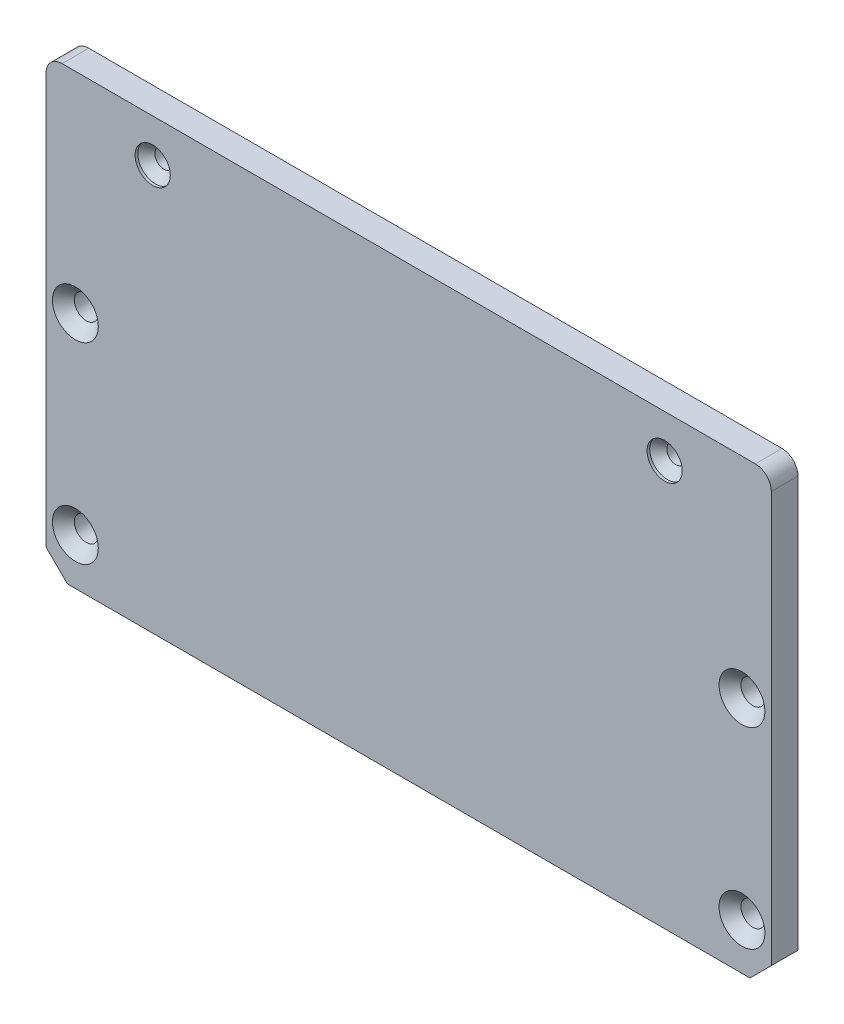
ISO-10303-21;
HEADER;
FILE_DESCRIPTION(('STEP AP214'),'2;1');
FILE_NAME('part.step','',(''),(''),'','','');
FILE_SCHEMA(('AUTOMOTIVE_DESIGN { 1 0 10303 214 1 1 1 1 }'));
ENDSEC;
DATA;
#1=APPLICATION_CONTEXT('core data for automotive mechanical design processes');
#2=APPLICATION_PROTOCOL_DEFINITION('international standard','automotive_design',2000,#1);
#3=PRODUCT_CONTEXT('',#1,'mechanical');
#4=PRODUCT('Part','Part','',(#3));
#5=PRODUCT_RELATED_PRODUCT_CATEGORY('part','',(#4));
#6=PRODUCT_DEFINITION_FORMATION('','',#4);
#7=PRODUCT_DEFINITION_CONTEXT('part definition',#1,'design');
#8=PRODUCT_DEFINITION('design','',#6,#7);
#9=PRODUCT_DEFINITION_SHAPE('','',#8);
#10=(LENGTH_UNIT() NAMED_UNIT(*) SI_UNIT(.MILLI.,.METRE.));
#11=(NAMED_UNIT(*) PLANE_ANGLE_UNIT() SI_UNIT($,.RADIAN.));
#12=(NAMED_UNIT(*) SI_UNIT($,.STERADIAN.) SOLID_ANGLE_UNIT());
#13=UNCERTAINTY_MEASURE_WITH_UNIT(LENGTH_MEASURE(1.E-05),#10,'distance_accuracy_value','');
#14=(GEOMETRIC_REPRESENTATION_CONTEXT(3) GLOBAL_UNCERTAINTY_ASSIGNED_CONTEXT((#13)) GLOBAL_UNIT_ASSIGNED_CONTEXT((#10,
#11,#12)) REPRESENTATION_CONTEXT('',''));
#15=CARTESIAN_POINT('',(0.,0.,0.));
#16=DIRECTION('',(0.,0.,1.));
#17=DIRECTION('',(1.,0.,0.));
#18=AXIS2_PLACEMENT_3D('',#15,#16,#17);
#19=CARTESIAN_POINT('',(-68.,0.,5.));
#20=DIRECTION('',(1.,0.,0.));
#21=DIRECTION('',(0.,0.,-1.));
#22=AXIS2_PLACEMENT_3D('',#19,#20,#21);
#23=PLANE('',#22);
#24=DIRECTION('',(0.,-1.,0.));
#25=VECTOR('',#24,1.);
#26=CARTESIAN_POINT('',(-68.,0.,5.));
#27=LINE('',#26,#25);
#28=CARTESIAN_POINT('',(-68.,81.,5.));
#29=VERTEX_POINT('',#28);
#30=CARTESIAN_POINT('',(-68.,4.00000000000005,5.));
#31=VERTEX_POINT('',#30);
#32=EDGE_CURVE('E110',#29,#31,#27,.T.);
#33=ORIENTED_EDGE('',*,*,#32,.F.);
#34=DIRECTION('',(0.,0.,-1.));
#35=VECTOR('',#34,1.);
#36=CARTESIAN_POINT('',(-68.,81.,5.));
#37=LINE('',#36,#35);
#38=CARTESIAN_POINT('',(-68.,81.,0.));
#39=VERTEX_POINT('',#38);
#40=EDGE_CURVE('E11',#29,#39,#37,.T.);
#41=ORIENTED_EDGE('',*,*,#40,.T.);
#42=DIRECTION('',(0.,-1.,0.));
#43=VECTOR('',#42,1.);
#44=CARTESIAN_POINT('',(-68.,0.,0.));
#45=LINE('',#44,#43);
#46=CARTESIAN_POINT('',(-68.,4.00000000000005,0.));
#47=VERTEX_POINT('',#46);
#48=EDGE_CURVE('E112',#39,#47,#45,.T.);
#49=ORIENTED_EDGE('',*,*,#48,.T.);
#50=DIRECTION('',(0.,0.,1.));
#51=VECTOR('',#50,1.);
#52=CARTESIAN_POINT('',(-68.,4.00000000000005,5.));
#53=LINE('',#52,#51);
#54=EDGE_CURVE('E125',#47,#31,#53,.T.);
#55=ORIENTED_EDGE('',*,*,#54,.T.);
#56=EDGE_LOOP('',(#33,#41,#49,#55));
#57=FACE_BOUND('',#56,.T.);
#58=ADVANCED_FACE('F17',(#57),#23,.F.);
#59=CARTESIAN_POINT('',(-68.,0.,5.));
#60=DIRECTION('',(0.,1.,0.));
#61=DIRECTION('',(0.,0.,1.));
#62=AXIS2_PLACEMENT_3D('',#59,#60,#61);
#63=PLANE('',#62);
#64=DIRECTION('',(1.,0.,0.));
#65=VECTOR('',#64,1.);
#66=CARTESIAN_POINT('',(-68.,0.,0.));
#67=LINE('',#66,#65);
#68=CARTESIAN_POINT('',(-64.,0.,0.));
#69=VERTEX_POINT('',#68);
#70=CARTESIAN_POINT('',(64.,0.,0.));
#71=VERTEX_POINT('',#70);
#72=EDGE_CURVE('E107',#69,#71,#67,.T.);
#73=ORIENTED_EDGE('',*,*,#72,.T.);
#74=DIRECTION('',(0.,0.,1.));
#75=VECTOR('',#74,1.);
#76=CARTESIAN_POINT('',(64.,0.,5.));
#77=LINE('',#76,#75);
#78=CARTESIAN_POINT('',(64.,0.,5.));
#79=VERTEX_POINT('',#78);
#80=EDGE_CURVE('E90',#71,#79,#77,.T.);
#81=ORIENTED_EDGE('',*,*,#80,.T.);
#82=DIRECTION('',(1.,0.,0.));
#83=VECTOR('',#82,1.);
#84=CARTESIAN_POINT('',(-68.,0.,5.));
#85=LINE('',#84,#83);
#86=CARTESIAN_POINT('',(-64.,0.,5.));
#87=VERTEX_POINT('',#86);
#88=EDGE_CURVE('E187',#87,#79,#85,.T.);
#89=ORIENTED_EDGE('',*,*,#88,.F.);
#90=DIRECTION('',(0.,0.,-1.));
#91=VECTOR('',#90,1.);
#92=CARTESIAN_POINT('',(-64.,0.,5.));
#93=LINE('',#92,#91);
#94=EDGE_CURVE('E95',#87,#69,#93,.T.);
#95=ORIENTED_EDGE('',*,*,#94,.T.);
#96=EDGE_LOOP('',(#73,#81,#89,#95));
#97=FACE_BOUND('',#96,.T.);
#98=ADVANCED_FACE('F160',(#97),#63,.F.);
#99=CARTESIAN_POINT('',(68.,0.,5.));
#100=DIRECTION('',(-1.,0.,0.));
#101=DIRECTION('',(0.,0.,1.));
#102=AXIS2_PLACEMENT_3D('',#99,#100,#101);
#103=PLANE('',#102);
#104=DIRECTION('',(0.,1.,0.));
#105=VECTOR('',#104,1.);
#106=CARTESIAN_POINT('',(68.,0.,0.));
#107=LINE('',#106,#105);
#108=CARTESIAN_POINT('',(68.,4.,0.));
#109=VERTEX_POINT('',#108);
#110=CARTESIAN_POINT('',(68.,81.,0.));
#111=VERTEX_POINT('',#110);
#112=EDGE_CURVE('E99',#109,#111,#107,.T.);
#113=ORIENTED_EDGE('',*,*,#112,.T.);
#114=DIRECTION('',(0.,0.,-1.));
#115=VECTOR('',#114,1.);
#116=CARTESIAN_POINT('',(68.,81.,5.));
#117=LINE('',#116,#115);
#118=CARTESIAN_POINT('',(68.,81.,5.));
#119=VERTEX_POINT('',#118);
#120=EDGE_CURVE('E40',#111,#119,#117,.F.);
#121=ORIENTED_EDGE('',*,*,#120,.T.);
#122=DIRECTION('',(0.,1.,0.));
#123=VECTOR('',#122,1.);
#124=CARTESIAN_POINT('',(68.,0.,5.));
#125=LINE('',#124,#123);
#126=CARTESIAN_POINT('',(68.,4.,5.));
#127=VERTEX_POINT('',#126);
#128=EDGE_CURVE('E100',#127,#119,#125,.T.);
#129=ORIENTED_EDGE('',*,*,#128,.F.);
#130=DIRECTION('',(0.,0.,-1.));
#131=VECTOR('',#130,1.);
#132=CARTESIAN_POINT('',(68.,4.,5.));
#133=LINE('',#132,#131);
#134=EDGE_CURVE('E89',#127,#109,#133,.T.);
#135=ORIENTED_EDGE('',*,*,#134,.T.);
#136=EDGE_LOOP('',(#113,#121,#129,#135));
#137=FACE_BOUND('',#136,.T.);
#138=ADVANCED_FACE('F98',(#137),#103,.F.);
#139=CARTESIAN_POINT('',(-68.,84.,5.));
#140=DIRECTION('',(0.,-1.,0.));
#141=DIRECTION('',(0.,0.,-1.));
#142=AXIS2_PLACEMENT_3D('',#139,#140,#141);
#143=PLANE('',#142);
#144=DIRECTION('',(-1.,0.,0.));
#145=VECTOR('',#144,1.);
#146=CARTESIAN_POINT('',(-68.,84.,5.));
#147=LINE('',#146,#145);
#148=CARTESIAN_POINT('',(65.,84.,5.));
#149=VERTEX_POINT('',#148);
#150=CARTESIAN_POINT('',(-65.,84.,5.));
#151=VERTEX_POINT('',#150);
#152=EDGE_CURVE('E101',#149,#151,#147,.T.);
#153=ORIENTED_EDGE('',*,*,#152,.F.);
#154=DIRECTION('',(0.,0.,-1.));
#155=VECTOR('',#154,1.);
#156=CARTESIAN_POINT('',(65.,84.,5.));
#157=LINE('',#156,#155);
#158=CARTESIAN_POINT('',(65.,84.,0.));
#159=VERTEX_POINT('',#158);
#160=EDGE_CURVE('E130',#149,#159,#157,.T.);
#161=ORIENTED_EDGE('',*,*,#160,.T.);
#162=DIRECTION('',(-1.,0.,0.));
#163=VECTOR('',#162,1.);
#164=CARTESIAN_POINT('',(-68.,84.,0.));
#165=LINE('',#164,#163);
#166=CARTESIAN_POINT('',(-65.,84.,0.));
#167=VERTEX_POINT('',#166);
#168=EDGE_CURVE('E106',#159,#167,#165,.T.);
#169=ORIENTED_EDGE('',*,*,#168,.T.);
#170=DIRECTION('',(0.,0.,-1.));
#171=VECTOR('',#170,1.);
#172=CARTESIAN_POINT('',(-65.,84.,5.));
#173=LINE('',#172,#171);
#174=EDGE_CURVE('E128',#167,#151,#173,.F.);
#175=ORIENTED_EDGE('',*,*,#174,.T.);
#176=EDGE_LOOP('',(#153,#161,#169,#175));
#177=FACE_BOUND('',#176,.T.);
#178=ADVANCED_FACE('F143',(#177),#143,.F.);
#179=CARTESIAN_POINT('',(0.,0.,5.));
#180=DIRECTION('',(0.,0.,-1.));
#181=DIRECTION('',(-1.,0.,0.));
#182=AXIS2_PLACEMENT_3D('',#179,#180,#181);
#183=PLANE('',#182);
#184=CARTESIAN_POINT('',(-48.,76.,5.));
#185=DIRECTION('',(0.,0.,1.));
#186=DIRECTION('',(1.,0.,0.));
#187=AXIS2_PLACEMENT_3D('',#184,#185,#186);
#188=CIRCLE('',#187,3.3);
#189=CARTESIAN_POINT('',(-44.7,76.,5.));
#190=VERTEX_POINT('',#189);
#191=EDGE_CURVE('E252',#190,#190,#188,.T.);
#192=ORIENTED_EDGE('',*,*,#191,.F.);
#193=EDGE_LOOP('',(#192));
#194=FACE_BOUND('',#193,.T.);
#195=CARTESIAN_POINT('',(48.,76.,5.));
#196=DIRECTION('',(0.,0.,1.));
#197=DIRECTION('',(1.,0.,0.));
#198=AXIS2_PLACEMENT_3D('',#195,#196,#197);
#199=CIRCLE('',#198,3.3);
#200=CARTESIAN_POINT('',(51.3,76.,5.));
#201=VERTEX_POINT('',#200);
#202=EDGE_CURVE('E240',#201,#201,#199,.T.);
#203=ORIENTED_EDGE('',*,*,#202,.F.);
#204=EDGE_LOOP('',(#203));
#205=FACE_BOUND('',#204,.T.);
#206=CARTESIAN_POINT('',(-62.5,44.7,5.));
#207=DIRECTION('',(0.,0.,1.));
#208=DIRECTION('',(1.,0.,0.));
#209=AXIS2_PLACEMENT_3D('',#206,#207,#208);
#210=CIRCLE('',#209,4.3);
#211=CARTESIAN_POINT('',(-58.2,44.7,5.));
#212=VERTEX_POINT('',#211);
#213=EDGE_CURVE('E228',#212,#212,#210,.T.);
#214=ORIENTED_EDGE('',*,*,#213,.F.);
#215=EDGE_LOOP('',(#214));
#216=FACE_BOUND('',#215,.T.);
#217=CARTESIAN_POINT('',(62.5,44.7,5.));
#218=DIRECTION('',(0.,0.,1.));
#219=DIRECTION('',(1.,0.,0.));
#220=AXIS2_PLACEMENT_3D('',#217,#218,#219);
#221=CIRCLE('',#220,4.3);
#222=CARTESIAN_POINT('',(66.8,44.7,5.));
#223=VERTEX_POINT('',#222);
#224=EDGE_CURVE('E219',#223,#223,#221,.T.);
#225=ORIENTED_EDGE('',*,*,#224,.F.);
#226=EDGE_LOOP('',(#225));
#227=FACE_BOUND('',#226,.T.);
#228=CARTESIAN_POINT('',(62.5,8.7,5.));
#229=DIRECTION('',(0.,0.,1.));
#230=DIRECTION('',(1.,0.,0.));
#231=AXIS2_PLACEMENT_3D('',#228,#229,#230);
#232=CIRCLE('',#231,4.3);
#233=CARTESIAN_POINT('',(66.8,8.7,5.));
#234=VERTEX_POINT('',#233);
#235=EDGE_CURVE('E210',#234,#234,#232,.T.);
#236=ORIENTED_EDGE('',*,*,#235,.F.);
#237=EDGE_LOOP('',(#236));
#238=FACE_BOUND('',#237,.T.);
#239=CARTESIAN_POINT('',(-62.5,8.7,5.));
#240=DIRECTION('',(0.,0.,1.));
#241=DIRECTION('',(1.,0.,0.));
#242=AXIS2_PLACEMENT_3D('',#239,#240,#241);
#243=CIRCLE('',#242,4.3);
#244=CARTESIAN_POINT('',(-58.2,8.7,5.));
#245=VERTEX_POINT('',#244);
#246=EDGE_CURVE('E199',#245,#245,#243,.T.);
#247=ORIENTED_EDGE('',*,*,#246,.F.);
#248=EDGE_LOOP('',(#247));
#249=FACE_BOUND('',#248,.T.);
#250=ORIENTED_EDGE('',*,*,#128,.T.);
#251=CARTESIAN_POINT('',(65.,81.,5.));
#252=DIRECTION('',(0.,0.,-1.));
#253=DIRECTION('',(-1.,0.,0.));
#254=AXIS2_PLACEMENT_3D('',#251,#252,#253);
#255=CIRCLE('',#254,3.);
#256=EDGE_CURVE('E25',#119,#149,#255,.F.);
#257=ORIENTED_EDGE('',*,*,#256,.T.);
#258=ORIENTED_EDGE('',*,*,#152,.T.);
#259=CARTESIAN_POINT('',(-65.,81.,5.));
#260=DIRECTION('',(0.,0.,-1.));
#261=DIRECTION('',(-1.,0.,0.));
#262=AXIS2_PLACEMENT_3D('',#259,#260,#261);
#263=CIRCLE('',#262,3.);
#264=EDGE_CURVE('E32',#151,#29,#263,.F.);
#265=ORIENTED_EDGE('',*,*,#264,.T.);
#266=ORIENTED_EDGE('',*,*,#32,.T.);
#267=DIRECTION('',(-0.707106781186545,0.70710678118655,0.));
#268=VECTOR('',#267,1.);
#269=CARTESIAN_POINT('',(-64.,0.,5.));
#270=LINE('',#269,#268);
#271=EDGE_CURVE('E121',#31,#87,#270,.F.);
#272=ORIENTED_EDGE('',*,*,#271,.T.);
#273=ORIENTED_EDGE('',*,*,#88,.T.);
#274=DIRECTION('',(-0.707106781186551,-0.707106781186544,0.));
#275=VECTOR('',#274,1.);
#276=CARTESIAN_POINT('',(68.,4.,5.));
#277=LINE('',#276,#275);
#278=EDGE_CURVE('E123',#79,#127,#277,.F.);
#279=ORIENTED_EDGE('',*,*,#278,.T.);
#280=EDGE_LOOP('',(#250,#257,#258,#265,#266,#272,#273,#279));
#281=FACE_BOUND('',#280,.T.);
#282=ADVANCED_FACE('F139',(#194,#205,#216,#227,#238,#249,#281),#183,.F.);
#283=CARTESIAN_POINT('',(0.,0.,0.));
#284=DIRECTION('',(0.,0.,-1.));
#285=DIRECTION('',(-1.,0.,0.));
#286=AXIS2_PLACEMENT_3D('',#283,#284,#285);
#287=PLANE('',#286);
#288=CARTESIAN_POINT('',(-48.,76.,0.));
#289=DIRECTION('',(0.,0.,1.));
#290=DIRECTION('',(1.,0.,0.));
#291=AXIS2_PLACEMENT_3D('',#288,#289,#290);
#292=CIRCLE('',#291,1.7);
#293=CARTESIAN_POINT('',(-46.3,76.,0.));
#294=VERTEX_POINT('',#293);
#295=EDGE_CURVE('E243',#294,#294,#292,.T.);
#296=ORIENTED_EDGE('',*,*,#295,.T.);
#297=EDGE_LOOP('',(#296));
#298=FACE_BOUND('',#297,.T.);
#299=CARTESIAN_POINT('',(48.,76.,0.));
#300=DIRECTION('',(0.,0.,1.));
#301=DIRECTION('',(1.,0.,0.));
#302=AXIS2_PLACEMENT_3D('',#299,#300,#301);
#303=CIRCLE('',#302,1.7);
#304=CARTESIAN_POINT('',(49.7,76.,0.));
#305=VERTEX_POINT('',#304);
#306=EDGE_CURVE('E231',#305,#305,#303,.T.);
#307=ORIENTED_EDGE('',*,*,#306,.T.);
#308=EDGE_LOOP('',(#307));
#309=FACE_BOUND('',#308,.T.);
#310=CARTESIAN_POINT('',(-62.5,44.7,0.));
#311=DIRECTION('',(0.,0.,1.));
#312=DIRECTION('',(1.,0.,0.));
#313=AXIS2_PLACEMENT_3D('',#310,#311,#312);
#314=CIRCLE('',#313,2.25);
#315=CARTESIAN_POINT('',(-60.25,44.7,0.));
#316=VERTEX_POINT('',#315);
#317=EDGE_CURVE('E222',#316,#316,#314,.T.);
#318=ORIENTED_EDGE('',*,*,#317,.T.);
#319=EDGE_LOOP('',(#318));
#320=FACE_BOUND('',#319,.T.);
#321=CARTESIAN_POINT('',(62.5,44.7,0.));
#322=DIRECTION('',(0.,0.,1.));
#323=DIRECTION('',(1.,0.,0.));
#324=AXIS2_PLACEMENT_3D('',#321,#322,#323);
#325=CIRCLE('',#324,2.25);
#326=CARTESIAN_POINT('',(64.75,44.7,0.));
#327=VERTEX_POINT('',#326);
#328=EDGE_CURVE('E213',#327,#327,#325,.T.);
#329=ORIENTED_EDGE('',*,*,#328,.T.);
#330=EDGE_LOOP('',(#329));
#331=FACE_BOUND('',#330,.T.);
#332=CARTESIAN_POINT('',(62.5,8.7,0.));
#333=DIRECTION('',(0.,0.,1.));
#334=DIRECTION('',(1.,0.,0.));
#335=AXIS2_PLACEMENT_3D('',#332,#333,#334);
#336=CIRCLE('',#335,2.25);
#337=CARTESIAN_POINT('',(64.75,8.7,0.));
#338=VERTEX_POINT('',#337);
#339=EDGE_CURVE('E204',#338,#338,#336,.T.);
#340=ORIENTED_EDGE('',*,*,#339,.T.);
#341=EDGE_LOOP('',(#340));
#342=FACE_BOUND('',#341,.T.);
#343=CARTESIAN_POINT('',(-62.5,8.7,0.));
#344=DIRECTION('',(0.,0.,1.));
#345=DIRECTION('',(1.,0.,0.));
#346=AXIS2_PLACEMENT_3D('',#343,#344,#345);
#347=CIRCLE('',#346,2.25);
#348=CARTESIAN_POINT('',(-60.25,8.7,0.));
#349=VERTEX_POINT('',#348);
#350=EDGE_CURVE('E192',#349,#349,#347,.T.);
#351=ORIENTED_EDGE('',*,*,#350,.T.);
#352=EDGE_LOOP('',(#351));
#353=FACE_BOUND('',#352,.T.);
#354=ORIENTED_EDGE('',*,*,#168,.F.);
#355=CARTESIAN_POINT('',(65.,81.,0.));
#356=DIRECTION('',(0.,0.,-1.));
#357=DIRECTION('',(-1.,0.,0.));
#358=AXIS2_PLACEMENT_3D('',#355,#356,#357);
#359=CIRCLE('',#358,3.);
#360=EDGE_CURVE('E105',#159,#111,#359,.T.);
#361=ORIENTED_EDGE('',*,*,#360,.T.);
#362=ORIENTED_EDGE('',*,*,#112,.F.);
#363=DIRECTION('',(0.707106781186551,0.707106781186544,0.));
#364=VECTOR('',#363,1.);
#365=CARTESIAN_POINT('',(31.9999999999996,-32.,0.));
#366=LINE('',#365,#364);
#367=EDGE_CURVE('E85',#109,#71,#366,.F.);
#368=ORIENTED_EDGE('',*,*,#367,.T.);
#369=ORIENTED_EDGE('',*,*,#72,.F.);
#370=DIRECTION('',(0.707106781186545,-0.70710678118655,0.));
#371=VECTOR('',#370,1.);
#372=CARTESIAN_POINT('',(-32.,-32.,0.));
#373=LINE('',#372,#371);
#374=EDGE_CURVE('E96',#69,#47,#373,.F.);
#375=ORIENTED_EDGE('',*,*,#374,.T.);
#376=ORIENTED_EDGE('',*,*,#48,.F.);
#377=CARTESIAN_POINT('',(-65.,81.,0.));
#378=DIRECTION('',(0.,0.,-1.));
#379=DIRECTION('',(-1.,0.,0.));
#380=AXIS2_PLACEMENT_3D('',#377,#378,#379);
#381=CIRCLE('',#380,3.);
#382=EDGE_CURVE('E133',#39,#167,#381,.T.);
#383=ORIENTED_EDGE('',*,*,#382,.T.);
#384=EDGE_LOOP('',(#354,#361,#362,#368,#369,#375,#376,#383));
#385=FACE_BOUND('',#384,.T.);
#386=ADVANCED_FACE('F104',(#298,#309,#320,#331,#342,#353,#385),#287,.T.);
#387=CARTESIAN_POINT('',(-62.5,8.7,5.));
#388=DIRECTION('',(0.,0.,1.));
#389=DIRECTION('',(1.,0.,0.));
#390=AXIS2_PLACEMENT_3D('',#387,#388,#389);
#391=CYLINDRICAL_SURFACE('',#390,2.25);
#392=ORIENTED_EDGE('',*,*,#350,.F.);
#393=EDGE_LOOP('',(#392));
#394=FACE_BOUND('',#393,.T.);
#395=CARTESIAN_POINT('',(-62.5,8.7,2.95));
#396=DIRECTION('',(0.,0.,1.));
#397=DIRECTION('',(1.,0.,0.));
#398=AXIS2_PLACEMENT_3D('',#395,#396,#397);
#399=CIRCLE('',#398,2.25);
#400=CARTESIAN_POINT('',(-60.25,8.7,2.95));
#401=VERTEX_POINT('',#400);
#402=EDGE_CURVE('E195',#401,#401,#399,.T.);
#403=ORIENTED_EDGE('',*,*,#402,.T.);
#404=EDGE_LOOP('',(#403));
#405=FACE_BOUND('',#404,.T.);
#406=ADVANCED_FACE('F273',(#394,#405),#391,.F.);
#407=CARTESIAN_POINT('',(-62.5,8.7,5.));
#408=DIRECTION('',(0.,0.,1.));
#409=DIRECTION('',(1.,0.,0.));
#410=AXIS2_PLACEMENT_3D('',#407,#408,#409);
#411=CONICAL_SURFACE('',#410,4.3,0.785398163397448);
#412=ORIENTED_EDGE('',*,*,#402,.F.);
#413=EDGE_LOOP('',(#412));
#414=FACE_BOUND('',#413,.T.);
#415=ORIENTED_EDGE('',*,*,#246,.T.);
#416=EDGE_LOOP('',(#415));
#417=FACE_BOUND('',#416,.T.);
#418=ADVANCED_FACE('F270',(#414,#417),#411,.F.);
#419=CARTESIAN_POINT('',(62.5,8.7,5.));
#420=DIRECTION('',(0.,0.,1.));
#421=DIRECTION('',(1.,0.,0.));
#422=AXIS2_PLACEMENT_3D('',#419,#420,#421);
#423=CYLINDRICAL_SURFACE('',#422,2.25);
#424=ORIENTED_EDGE('',*,*,#339,.F.);
#425=EDGE_LOOP('',(#424));
#426=FACE_BOUND('',#425,.T.);
#427=CARTESIAN_POINT('',(62.5,8.7,2.95));
#428=DIRECTION('',(0.,0.,1.));
#429=DIRECTION('',(1.,0.,0.));
#430=AXIS2_PLACEMENT_3D('',#427,#428,#429);
#431=CIRCLE('',#430,2.25);
#432=CARTESIAN_POINT('',(64.75,8.7,2.95));
#433=VERTEX_POINT('',#432);
#434=EDGE_CURVE('E207',#433,#433,#431,.T.);
#435=ORIENTED_EDGE('',*,*,#434,.T.);
#436=EDGE_LOOP('',(#435));
#437=FACE_BOUND('',#436,.T.);
#438=ADVANCED_FACE('F272',(#426,#437),#423,.F.);
#439=CARTESIAN_POINT('',(62.5,8.7,5.));
#440=DIRECTION('',(0.,0.,1.));
#441=DIRECTION('',(1.,0.,0.));
#442=AXIS2_PLACEMENT_3D('',#439,#440,#441);
#443=CONICAL_SURFACE('',#442,4.3,0.785398163397448);
#444=ORIENTED_EDGE('',*,*,#434,.F.);
#445=EDGE_LOOP('',(#444));
#446=FACE_BOUND('',#445,.T.);
#447=ORIENTED_EDGE('',*,*,#235,.T.);
#448=EDGE_LOOP('',(#447));
#449=FACE_BOUND('',#448,.T.);
#450=ADVANCED_FACE('F280',(#446,#449),#443,.F.);
#451=CARTESIAN_POINT('',(62.5,44.7,5.));
#452=DIRECTION('',(0.,0.,1.));
#453=DIRECTION('',(1.,0.,0.));
#454=AXIS2_PLACEMENT_3D('',#451,#452,#453);
#455=CYLINDRICAL_SURFACE('',#454,2.25);
#456=ORIENTED_EDGE('',*,*,#328,.F.);
#457=EDGE_LOOP('',(#456));
#458=FACE_BOUND('',#457,.T.);
#459=CARTESIAN_POINT('',(62.5,44.7,2.95));
#460=DIRECTION('',(0.,0.,1.));
#461=DIRECTION('',(1.,0.,0.));
#462=AXIS2_PLACEMENT_3D('',#459,#460,#461);
#463=CIRCLE('',#462,2.25);
#464=CARTESIAN_POINT('',(64.75,44.7,2.95));
#465=VERTEX_POINT('',#464);
#466=EDGE_CURVE('E216',#465,#465,#463,.T.);
#467=ORIENTED_EDGE('',*,*,#466,.T.);
#468=EDGE_LOOP('',(#467));
#469=FACE_BOUND('',#468,.T.);
#470=ADVANCED_FACE('F342',(#458,#469),#455,.F.);
#471=CARTESIAN_POINT('',(62.5,44.7,5.));
#472=DIRECTION('',(0.,0.,1.));
#473=DIRECTION('',(1.,0.,0.));
#474=AXIS2_PLACEMENT_3D('',#471,#472,#473);
#475=CONICAL_SURFACE('',#474,4.3,0.785398163397448);
#476=ORIENTED_EDGE('',*,*,#466,.F.);
#477=EDGE_LOOP('',(#476));
#478=FACE_BOUND('',#477,.T.);
#479=ORIENTED_EDGE('',*,*,#224,.T.);
#480=EDGE_LOOP('',(#479));
#481=FACE_BOUND('',#480,.T.);
#482=ADVANCED_FACE('F351',(#478,#481),#475,.F.);
#483=CARTESIAN_POINT('',(-62.5,44.7,5.));
#484=DIRECTION('',(0.,0.,1.));
#485=DIRECTION('',(1.,0.,0.));
#486=AXIS2_PLACEMENT_3D('',#483,#484,#485);
#487=CYLINDRICAL_SURFACE('',#486,2.25);
#488=ORIENTED_EDGE('',*,*,#317,.F.);
#489=EDGE_LOOP('',(#488));
#490=FACE_BOUND('',#489,.T.);
#491=CARTESIAN_POINT('',(-62.5,44.7,2.95));
#492=DIRECTION('',(0.,0.,1.));
#493=DIRECTION('',(1.,0.,0.));
#494=AXIS2_PLACEMENT_3D('',#491,#492,#493);
#495=CIRCLE('',#494,2.25);
#496=CARTESIAN_POINT('',(-60.25,44.7,2.95));
#497=VERTEX_POINT('',#496);
#498=EDGE_CURVE('E225',#497,#497,#495,.T.);
#499=ORIENTED_EDGE('',*,*,#498,.T.);
#500=EDGE_LOOP('',(#499));
#501=FACE_BOUND('',#500,.T.);
#502=ADVANCED_FACE('F361',(#490,#501),#487,.F.);
#503=CARTESIAN_POINT('',(-62.5,44.7,5.));
#504=DIRECTION('',(0.,0.,1.));
#505=DIRECTION('',(1.,0.,0.));
#506=AXIS2_PLACEMENT_3D('',#503,#504,#505);
#507=CONICAL_SURFACE('',#506,4.3,0.785398163397448);
#508=ORIENTED_EDGE('',*,*,#498,.F.);
#509=EDGE_LOOP('',(#508));
#510=FACE_BOUND('',#509,.T.);
#511=ORIENTED_EDGE('',*,*,#213,.T.);
#512=EDGE_LOOP('',(#511));
#513=FACE_BOUND('',#512,.T.);
#514=ADVANCED_FACE('F172',(#510,#513),#507,.F.);
#515=CARTESIAN_POINT('',(68.,4.,5.));
#516=DIRECTION('',(-0.707106781186544,0.707106781186551,0.));
#517=DIRECTION('',(0.,0.,-1.));
#518=AXIS2_PLACEMENT_3D('',#515,#516,#517);
#519=PLANE('',#518);
#520=ORIENTED_EDGE('',*,*,#278,.F.);
#521=ORIENTED_EDGE('',*,*,#80,.F.);
#522=ORIENTED_EDGE('',*,*,#367,.F.);
#523=ORIENTED_EDGE('',*,*,#134,.F.);
#524=EDGE_LOOP('',(#520,#521,#522,#523));
#525=FACE_BOUND('',#524,.T.);
#526=ADVANCED_FACE('F88',(#525),#519,.F.);
#527=CARTESIAN_POINT('',(-64.,0.,5.));
#528=DIRECTION('',(0.70710678118655,0.707106781186545,0.));
#529=DIRECTION('',(0.,0.,-1.));
#530=AXIS2_PLACEMENT_3D('',#527,#528,#529);
#531=PLANE('',#530);
#532=ORIENTED_EDGE('',*,*,#271,.F.);
#533=ORIENTED_EDGE('',*,*,#54,.F.);
#534=ORIENTED_EDGE('',*,*,#374,.F.);
#535=ORIENTED_EDGE('',*,*,#94,.F.);
#536=EDGE_LOOP('',(#532,#533,#534,#535));
#537=FACE_BOUND('',#536,.T.);
#538=ADVANCED_FACE('F171',(#537),#531,.F.);
#539=CARTESIAN_POINT('',(48.,76.,5.));
#540=DIRECTION('',(0.,0.,1.));
#541=DIRECTION('',(1.,0.,0.));
#542=AXIS2_PLACEMENT_3D('',#539,#540,#541);
#543=CYLINDRICAL_SURFACE('',#542,1.7);
#544=ORIENTED_EDGE('',*,*,#306,.F.);
#545=EDGE_LOOP('',(#544));
#546=FACE_BOUND('',#545,.T.);
#547=CARTESIAN_POINT('',(48.,76.,2.9));
#548=DIRECTION('',(0.,0.,1.));
#549=DIRECTION('',(1.,0.,0.));
#550=AXIS2_PLACEMENT_3D('',#547,#548,#549);
#551=CIRCLE('',#550,1.7);
#552=CARTESIAN_POINT('',(49.7,76.,2.9));
#553=VERTEX_POINT('',#552);
#554=EDGE_CURVE('E234',#553,#553,#551,.T.);
#555=ORIENTED_EDGE('',*,*,#554,.T.);
#556=EDGE_LOOP('',(#555));
#557=FACE_BOUND('',#556,.T.);
#558=ADVANCED_FACE('F174',(#546,#557),#543,.F.);
#559=CARTESIAN_POINT('',(48.,76.,4.5));
#560=DIRECTION('',(0.,0.,1.));
#561=DIRECTION('',(1.,0.,0.));
#562=AXIS2_PLACEMENT_3D('',#559,#560,#561);
#563=CONICAL_SURFACE('',#562,3.3,0.785398163397448);
#564=ORIENTED_EDGE('',*,*,#554,.F.);
#565=EDGE_LOOP('',(#564));
#566=FACE_BOUND('',#565,.T.);
#567=CARTESIAN_POINT('',(48.,76.,4.5));
#568=DIRECTION('',(0.,0.,1.));
#569=DIRECTION('',(1.,0.,0.));
#570=AXIS2_PLACEMENT_3D('',#567,#568,#569);
#571=CIRCLE('',#570,3.3);
#572=CARTESIAN_POINT('',(51.3,76.,4.5));
#573=VERTEX_POINT('',#572);
#574=EDGE_CURVE('E237',#573,#573,#571,.T.);
#575=ORIENTED_EDGE('',*,*,#574,.T.);
#576=EDGE_LOOP('',(#575));
#577=FACE_BOUND('',#576,.T.);
#578=ADVANCED_FACE('F179',(#566,#577),#563,.F.);
#579=CARTESIAN_POINT('',(48.,76.,5.));
#580=DIRECTION('',(0.,0.,1.));
#581=DIRECTION('',(1.,0.,0.));
#582=AXIS2_PLACEMENT_3D('',#579,#580,#581);
#583=CYLINDRICAL_SURFACE('',#582,3.3);
#584=ORIENTED_EDGE('',*,*,#574,.F.);
#585=EDGE_LOOP('',(#584));
#586=FACE_BOUND('',#585,.T.);
#587=ORIENTED_EDGE('',*,*,#202,.T.);
#588=EDGE_LOOP('',(#587));
#589=FACE_BOUND('',#588,.T.);
#590=ADVANCED_FACE('F406',(#586,#589),#583,.F.);
#591=CARTESIAN_POINT('',(-48.,76.,5.));
#592=DIRECTION('',(0.,0.,1.));
#593=DIRECTION('',(1.,0.,0.));
#594=AXIS2_PLACEMENT_3D('',#591,#592,#593);
#595=CYLINDRICAL_SURFACE('',#594,1.7);
#596=ORIENTED_EDGE('',*,*,#295,.F.);
#597=EDGE_LOOP('',(#596));
#598=FACE_BOUND('',#597,.T.);
#599=CARTESIAN_POINT('',(-48.,76.,2.9));
#600=DIRECTION('',(0.,0.,1.));
#601=DIRECTION('',(1.,0.,0.));
#602=AXIS2_PLACEMENT_3D('',#599,#600,#601);
#603=CIRCLE('',#602,1.7);
#604=CARTESIAN_POINT('',(-46.3,76.,2.9));
#605=VERTEX_POINT('',#604);
#606=EDGE_CURVE('E246',#605,#605,#603,.T.);
#607=ORIENTED_EDGE('',*,*,#606,.T.);
#608=EDGE_LOOP('',(#607));
#609=FACE_BOUND('',#608,.T.);
#610=ADVANCED_FACE('F416',(#598,#609),#595,.F.);
#611=CARTESIAN_POINT('',(-48.,76.,4.5));
#612=DIRECTION('',(0.,0.,1.));
#613=DIRECTION('',(1.,0.,0.));
#614=AXIS2_PLACEMENT_3D('',#611,#612,#613);
#615=CONICAL_SURFACE('',#614,3.3,0.785398163397448);
#616=ORIENTED_EDGE('',*,*,#606,.F.);
#617=EDGE_LOOP('',(#616));
#618=FACE_BOUND('',#617,.T.);
#619=CARTESIAN_POINT('',(-48.,76.,4.5));
#620=DIRECTION('',(0.,0.,1.));
#621=DIRECTION('',(1.,0.,0.));
#622=AXIS2_PLACEMENT_3D('',#619,#620,#621);
#623=CIRCLE('',#622,3.3);
#624=CARTESIAN_POINT('',(-44.7,76.,4.5));
#625=VERTEX_POINT('',#624);
#626=EDGE_CURVE('E249',#625,#625,#623,.T.);
#627=ORIENTED_EDGE('',*,*,#626,.T.);
#628=EDGE_LOOP('',(#627));
#629=FACE_BOUND('',#628,.T.);
#630=ADVANCED_FACE('F155',(#618,#629),#615,.F.);
#631=CARTESIAN_POINT('',(-48.,76.,5.));
#632=DIRECTION('',(0.,0.,1.));
#633=DIRECTION('',(1.,0.,0.));
#634=AXIS2_PLACEMENT_3D('',#631,#632,#633);
#635=CYLINDRICAL_SURFACE('',#634,3.3);
#636=ORIENTED_EDGE('',*,*,#626,.F.);
#637=EDGE_LOOP('',(#636));
#638=FACE_BOUND('',#637,.T.);
#639=ORIENTED_EDGE('',*,*,#191,.T.);
#640=EDGE_LOOP('',(#639));
#641=FACE_BOUND('',#640,.T.);
#642=ADVANCED_FACE('F148',(#638,#641),#635,.F.);
#643=CARTESIAN_POINT('',(65.,81.,5.));
#644=DIRECTION('',(0.,0.,-1.));
#645=DIRECTION('',(-1.,0.,0.));
#646=AXIS2_PLACEMENT_3D('',#643,#644,#645);
#647=CYLINDRICAL_SURFACE('',#646,3.);
#648=ORIENTED_EDGE('',*,*,#256,.F.);
#649=ORIENTED_EDGE('',*,*,#120,.F.);
#650=ORIENTED_EDGE('',*,*,#360,.F.);
#651=ORIENTED_EDGE('',*,*,#160,.F.);
#652=EDGE_LOOP('',(#648,#649,#650,#651));
#653=FACE_BOUND('',#652,.T.);
#654=ADVANCED_FACE('F146',(#653),#647,.T.);
#655=CARTESIAN_POINT('',(-65.,81.,5.));
#656=DIRECTION('',(0.,0.,-1.));
#657=DIRECTION('',(-1.,0.,0.));
#658=AXIS2_PLACEMENT_3D('',#655,#656,#657);
#659=CYLINDRICAL_SURFACE('',#658,3.);
#660=ORIENTED_EDGE('',*,*,#264,.F.);
#661=ORIENTED_EDGE('',*,*,#174,.F.);
#662=ORIENTED_EDGE('',*,*,#382,.F.);
#663=ORIENTED_EDGE('',*,*,#40,.F.);
#664=EDGE_LOOP('',(#660,#661,#662,#663));
#665=FACE_BOUND('',#664,.T.);
#666=ADVANCED_FACE('F19',(#665),#659,.T.);
#667=CLOSED_SHELL('',(#58,#98,#138,#178,#282,#386,#406,#418,#438,#450,#470,#482,#502,#514,#526,
#538,#558,#578,#590,#610,#630,#642,#654,#666));
#668=MANIFOLD_SOLID_BREP('B1',#667);
#669=ADVANCED_BREP_SHAPE_REPRESENTATION('',(#18,#668),#14);
#670=SHAPE_DEFINITION_REPRESENTATION(#9,#669);
ENDSEC;
END-ISO-10303-21;
